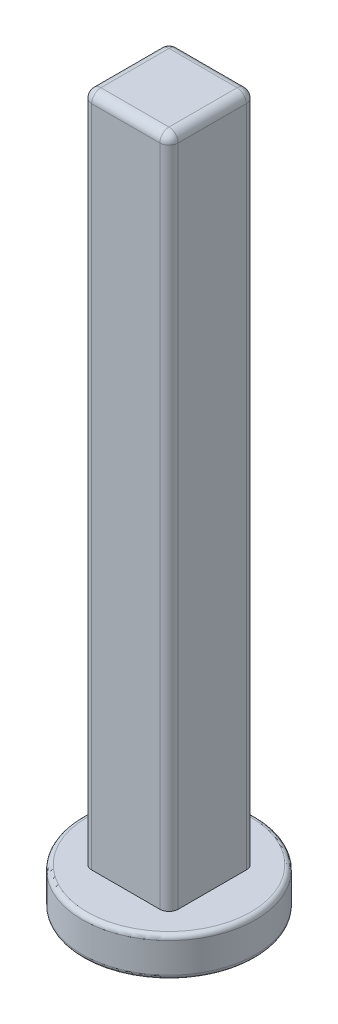
ISO-10303-21;
HEADER;
FILE_DESCRIPTION(('STEP AP214'),'2;1');
FILE_NAME('part.step','',(''),(''),'','','');
FILE_SCHEMA(('AUTOMOTIVE_DESIGN { 1 0 10303 214 1 1 1 1 }'));
ENDSEC;
DATA;
#1=APPLICATION_CONTEXT('core data for automotive mechanical design processes');
#2=APPLICATION_PROTOCOL_DEFINITION('international standard','automotive_design',2000,#1);
#3=PRODUCT_CONTEXT('',#1,'mechanical');
#4=PRODUCT('Part','Part','',(#3));
#5=PRODUCT_RELATED_PRODUCT_CATEGORY('part','',(#4));
#6=PRODUCT_DEFINITION_FORMATION('','',#4);
#7=PRODUCT_DEFINITION_CONTEXT('part definition',#1,'design');
#8=PRODUCT_DEFINITION('design','',#6,#7);
#9=PRODUCT_DEFINITION_SHAPE('','',#8);
#10=(LENGTH_UNIT() NAMED_UNIT(*) SI_UNIT(.MILLI.,.METRE.));
#11=(NAMED_UNIT(*) PLANE_ANGLE_UNIT() SI_UNIT($,.RADIAN.));
#12=(NAMED_UNIT(*) SI_UNIT($,.STERADIAN.) SOLID_ANGLE_UNIT());
#13=UNCERTAINTY_MEASURE_WITH_UNIT(LENGTH_MEASURE(1.E-05),#10,'distance_accuracy_value','');
#14=(GEOMETRIC_REPRESENTATION_CONTEXT(3) GLOBAL_UNCERTAINTY_ASSIGNED_CONTEXT((#13)) GLOBAL_UNIT_ASSIGNED_CONTEXT((#10,
#11,#12)) REPRESENTATION_CONTEXT('',''));
#15=CARTESIAN_POINT('',(0.,0.,0.));
#16=DIRECTION('',(0.,0.,1.));
#17=DIRECTION('',(1.,0.,0.));
#18=AXIS2_PLACEMENT_3D('',#15,#16,#17);
#19=CARTESIAN_POINT('',(0.,-1.7,0.));
#20=DIRECTION('',(0.,-1.,0.));
#21=DIRECTION('',(0.,0.,-1.));
#22=AXIS2_PLACEMENT_3D('',#19,#20,#21);
#23=PLANE('',#22);
#24=CARTESIAN_POINT('',(0.,-1.7,0.));
#25=DIRECTION('',(0.,1.,0.));
#26=DIRECTION('',(0.,0.,1.));
#27=AXIS2_PLACEMENT_3D('',#24,#25,#26);
#28=CIRCLE('',#27,3.55);
#29=CARTESIAN_POINT('',(0.,-1.7,3.55));
#30=VERTEX_POINT('',#29);
#31=CARTESIAN_POINT('',(3.55,-1.7,0.));
#32=VERTEX_POINT('',#31);
#33=EDGE_CURVE('E117',#30,#32,#28,.T.);
#34=ORIENTED_EDGE('',*,*,#33,.F.);
#35=CARTESIAN_POINT('',(0.,-1.7,0.));
#36=DIRECTION('',(0.,1.,0.));
#37=DIRECTION('',(1.,0.,0.));
#38=AXIS2_PLACEMENT_3D('',#35,#36,#37);
#39=CIRCLE('',#38,3.55);
#40=EDGE_CURVE('E114',#32,#30,#39,.T.);
#41=ORIENTED_EDGE('',*,*,#40,.F.);
#42=EDGE_LOOP('',(#34,#41));
#43=FACE_BOUND('',#42,.T.);
#44=ADVANCED_FACE('F16',(#43),#23,.T.);
#45=CARTESIAN_POINT('',(0.,-1.5,0.));
#46=DIRECTION('',(0.,-1.,0.));
#47=DIRECTION('',(0.,0.,-1.));
#48=AXIS2_PLACEMENT_3D('',#45,#46,#47);
#49=TOROIDAL_SURFACE('',#48,3.55,0.2);
#50=CARTESIAN_POINT('',(0.,-1.5,0.));
#51=DIRECTION('',(0.,-1.,0.));
#52=DIRECTION('',(0.,0.,-1.));
#53=AXIS2_PLACEMENT_3D('',#50,#51,#52);
#54=CIRCLE('',#53,3.75);
#55=CARTESIAN_POINT('',(0.,-1.5,-3.75));
#56=VERTEX_POINT('',#55);
#57=EDGE_CURVE('E125',#56,#56,#54,.F.);
#58=ORIENTED_EDGE('',*,*,#57,.F.);
#59=EDGE_LOOP('',(#58));
#60=FACE_BOUND('',#59,.T.);
#61=ORIENTED_EDGE('',*,*,#40,.T.);
#62=ORIENTED_EDGE('',*,*,#33,.T.);
#63=EDGE_LOOP('',(#61,#62));
#64=FACE_BOUND('',#63,.T.);
#65=ADVANCED_FACE('F124',(#60,#64),#49,.T.);
#66=CARTESIAN_POINT('',(-1.475,28.75,1.475));
#67=DIRECTION('',(-0.577350269189624,0.577350269189625,0.577350269189628));
#68=DIRECTION('',(0.,0.70710678118655,-0.707106781186545));
#69=AXIS2_PLACEMENT_3D('',#66,#67,#68);
#70=SPHERICAL_SURFACE('',#69,0.4);
#71=CARTESIAN_POINT('',(-1.70594010767585,28.9809401076759,1.70594010767585));
#72=VERTEX_POINT('',#71);
#73=VERTEX_LOOP('',#72);
#74=FACE_BOUND('',#73,.T.);
#75=CARTESIAN_POINT('',(-1.475,28.75,1.475));
#76=DIRECTION('',(0.,0.,1.));
#77=DIRECTION('',(1.,0.,0.));
#78=AXIS2_PLACEMENT_3D('',#75,#76,#77);
#79=CIRCLE('',#78,0.4);
#80=CARTESIAN_POINT('',(-1.875,28.75,1.475));
#81=VERTEX_POINT('',#80);
#82=CARTESIAN_POINT('',(-1.475,29.15,1.475));
#83=VERTEX_POINT('',#82);
#84=EDGE_CURVE('E336',#81,#83,#79,.F.);
#85=ORIENTED_EDGE('',*,*,#84,.F.);
#86=CARTESIAN_POINT('',(-1.475,28.75,1.475));
#87=DIRECTION('',(0.,1.,0.));
#88=DIRECTION('',(0.,0.,1.));
#89=AXIS2_PLACEMENT_3D('',#86,#87,#88);
#90=CIRCLE('',#89,0.400000000000001);
#91=CARTESIAN_POINT('',(-1.475,28.75,1.875));
#92=VERTEX_POINT('',#91);
#93=EDGE_CURVE('E333',#92,#81,#90,.F.);
#94=ORIENTED_EDGE('',*,*,#93,.F.);
#95=CARTESIAN_POINT('',(-1.475,28.75,1.475));
#96=DIRECTION('',(1.,0.,0.));
#97=DIRECTION('',(0.,0.,-1.));
#98=AXIS2_PLACEMENT_3D('',#95,#96,#97);
#99=CIRCLE('',#98,0.4);
#100=EDGE_CURVE('E99',#83,#92,#99,.T.);
#101=ORIENTED_EDGE('',*,*,#100,.F.);
#102=EDGE_LOOP('',(#85,#94,#101));
#103=FACE_BOUND('',#102,.T.);
#104=ADVANCED_FACE('F141',(#74,#103),#70,.T.);
#105=CARTESIAN_POINT('',(-1.475,28.75,-1.475));
#106=DIRECTION('',(-0.577350269189626,0.577350269189625,-0.577350269189626));
#107=DIRECTION('',(0.707106781186548,0.,-0.707106781186547));
#108=AXIS2_PLACEMENT_3D('',#105,#106,#107);
#109=SPHERICAL_SURFACE('',#108,0.4);
#110=CARTESIAN_POINT('',(-1.70594010767585,28.9809401076759,-1.70594010767585));
#111=VERTEX_POINT('',#110);
#112=VERTEX_LOOP('',#111);
#113=FACE_BOUND('',#112,.T.);
#114=CARTESIAN_POINT('',(-1.475,28.75,-1.475));
#115=DIRECTION('',(-1.,0.,0.));
#116=DIRECTION('',(0.,0.,1.));
#117=AXIS2_PLACEMENT_3D('',#114,#115,#116);
#118=CIRCLE('',#117,0.4);
#119=CARTESIAN_POINT('',(-1.475,28.75,-1.875));
#120=VERTEX_POINT('',#119);
#121=CARTESIAN_POINT('',(-1.475,29.15,-1.475));
#122=VERTEX_POINT('',#121);
#123=EDGE_CURVE('E328',#120,#122,#118,.F.);
#124=ORIENTED_EDGE('',*,*,#123,.F.);
#125=CARTESIAN_POINT('',(-1.475,28.75,-1.475));
#126=DIRECTION('',(0.,1.,0.));
#127=DIRECTION('',(0.,0.,1.));
#128=AXIS2_PLACEMENT_3D('',#125,#126,#127);
#129=CIRCLE('',#128,0.4);
#130=CARTESIAN_POINT('',(-1.875,28.75,-1.475));
#131=VERTEX_POINT('',#130);
#132=EDGE_CURVE('E325',#131,#120,#129,.F.);
#133=ORIENTED_EDGE('',*,*,#132,.F.);
#134=CARTESIAN_POINT('',(-1.475,28.75,-1.475));
#135=DIRECTION('',(0.,0.,1.));
#136=DIRECTION('',(1.,0.,0.));
#137=AXIS2_PLACEMENT_3D('',#134,#135,#136);
#138=CIRCLE('',#137,0.4);
#139=EDGE_CURVE('E339',#122,#131,#138,.T.);
#140=ORIENTED_EDGE('',*,*,#139,.F.);
#141=EDGE_LOOP('',(#124,#133,#140));
#142=FACE_BOUND('',#141,.T.);
#143=ADVANCED_FACE('F153',(#113,#142),#109,.T.);
#144=CARTESIAN_POINT('',(0.,-0.85,0.));
#145=DIRECTION('',(0.,-1.,0.));
#146=DIRECTION('',(0.,0.,-1.));
#147=AXIS2_PLACEMENT_3D('',#144,#145,#146);
#148=CYLINDRICAL_SURFACE('',#147,3.75);
#149=CARTESIAN_POINT('',(0.,-0.2,0.));
#150=DIRECTION('',(0.,-1.,0.));
#151=DIRECTION('',(0.,0.,-1.));
#152=AXIS2_PLACEMENT_3D('',#149,#150,#151);
#153=CIRCLE('',#152,3.75);
#154=CARTESIAN_POINT('',(0.,-0.2,-3.75));
#155=VERTEX_POINT('',#154);
#156=EDGE_CURVE('E225',#155,#155,#153,.F.);
#157=ORIENTED_EDGE('',*,*,#156,.F.);
#158=EDGE_LOOP('',(#157));
#159=FACE_BOUND('',#158,.T.);
#160=ORIENTED_EDGE('',*,*,#57,.T.);
#161=EDGE_LOOP('',(#160));
#162=FACE_BOUND('',#161,.T.);
#163=ADVANCED_FACE('F156',(#159,#162),#148,.T.);
#164=CARTESIAN_POINT('',(-0.7375,28.75,1.475));
#165=DIRECTION('',(1.,0.,0.));
#166=DIRECTION('',(0.,0.,-1.));
#167=AXIS2_PLACEMENT_3D('',#164,#165,#166);
#168=CYLINDRICAL_SURFACE('',#167,0.4);
#169=CARTESIAN_POINT('',(1.475,28.75,1.475));
#170=DIRECTION('',(1.,0.,0.));
#171=DIRECTION('',(0.,0.,-1.));
#172=AXIS2_PLACEMENT_3D('',#169,#170,#171);
#173=CIRCLE('',#172,0.4);
#174=CARTESIAN_POINT('',(1.475,29.15,1.475));
#175=VERTEX_POINT('',#174);
#176=CARTESIAN_POINT('',(1.475,28.75,1.875));
#177=VERTEX_POINT('',#176);
#178=EDGE_CURVE('E205',#175,#177,#173,.T.);
#179=ORIENTED_EDGE('',*,*,#178,.F.);
#180=DIRECTION('',(1.,0.,0.));
#181=VECTOR('',#180,1.);
#182=CARTESIAN_POINT('',(0.,29.15,1.475));
#183=LINE('',#182,#181);
#184=EDGE_CURVE('E206',#175,#83,#183,.F.);
#185=ORIENTED_EDGE('',*,*,#184,.T.);
#186=ORIENTED_EDGE('',*,*,#100,.T.);
#187=DIRECTION('',(1.,0.,0.));
#188=VECTOR('',#187,1.);
#189=CARTESIAN_POINT('',(-1.475,28.75,1.875));
#190=LINE('',#189,#188);
#191=EDGE_CURVE('E196',#177,#92,#190,.F.);
#192=ORIENTED_EDGE('',*,*,#191,.F.);
#193=EDGE_LOOP('',(#179,#185,#186,#192));
#194=FACE_BOUND('',#193,.T.);
#195=ADVANCED_FACE('F159',(#194),#168,.T.);
#196=CARTESIAN_POINT('',(-1.475,28.75,-0.7375));
#197=DIRECTION('',(0.,0.,1.));
#198=DIRECTION('',(1.,0.,0.));
#199=AXIS2_PLACEMENT_3D('',#196,#197,#198);
#200=CYLINDRICAL_SURFACE('',#199,0.4);
#201=ORIENTED_EDGE('',*,*,#84,.T.);
#202=DIRECTION('',(0.,0.,-1.));
#203=VECTOR('',#202,1.);
#204=CARTESIAN_POINT('',(-1.475,29.15,0.));
#205=LINE('',#204,#203);
#206=EDGE_CURVE('E151',#83,#122,#205,.T.);
#207=ORIENTED_EDGE('',*,*,#206,.T.);
#208=ORIENTED_EDGE('',*,*,#139,.T.);
#209=DIRECTION('',(0.,0.,1.));
#210=VECTOR('',#209,1.);
#211=CARTESIAN_POINT('',(-1.875,28.75,-1.475));
#212=LINE('',#211,#210);
#213=EDGE_CURVE('E208',#81,#131,#212,.F.);
#214=ORIENTED_EDGE('',*,*,#213,.F.);
#215=EDGE_LOOP('',(#201,#207,#208,#214));
#216=FACE_BOUND('',#215,.T.);
#217=ADVANCED_FACE('F163',(#216),#200,.T.);
#218=CARTESIAN_POINT('',(-1.475,0.,1.475));
#219=DIRECTION('',(0.,1.,0.));
#220=DIRECTION('',(0.,0.,1.));
#221=AXIS2_PLACEMENT_3D('',#218,#219,#220);
#222=CYLINDRICAL_SURFACE('',#221,0.400000000000001);
#223=CARTESIAN_POINT('',(-1.475,0.,1.475));
#224=DIRECTION('',(0.,1.,0.));
#225=DIRECTION('',(0.,0.,1.));
#226=AXIS2_PLACEMENT_3D('',#223,#224,#225);
#227=CIRCLE('',#226,0.400000000000001);
#228=CARTESIAN_POINT('',(-1.875,0.,1.475));
#229=VERTEX_POINT('',#228);
#230=CARTESIAN_POINT('',(-1.475,0.,1.875));
#231=VERTEX_POINT('',#230);
#232=EDGE_CURVE('E331',#229,#231,#227,.T.);
#233=ORIENTED_EDGE('',*,*,#232,.T.);
#234=DIRECTION('',(0.,1.,0.));
#235=VECTOR('',#234,1.);
#236=CARTESIAN_POINT('',(-1.475,0.,1.875));
#237=LINE('',#236,#235);
#238=EDGE_CURVE('E211',#92,#231,#237,.F.);
#239=ORIENTED_EDGE('',*,*,#238,.F.);
#240=ORIENTED_EDGE('',*,*,#93,.T.);
#241=DIRECTION('',(0.,1.,0.));
#242=VECTOR('',#241,1.);
#243=CARTESIAN_POINT('',(-1.875,0.,1.475));
#244=LINE('',#243,#242);
#245=EDGE_CURVE('E216',#229,#81,#244,.T.);
#246=ORIENTED_EDGE('',*,*,#245,.F.);
#247=EDGE_LOOP('',(#233,#239,#240,#246));
#248=FACE_BOUND('',#247,.T.);
#249=ADVANCED_FACE('F167',(#248),#222,.T.);
#250=CARTESIAN_POINT('',(0.7375,28.75,-1.475));
#251=DIRECTION('',(-1.,0.,0.));
#252=DIRECTION('',(0.,0.,1.));
#253=AXIS2_PLACEMENT_3D('',#250,#251,#252);
#254=CYLINDRICAL_SURFACE('',#253,0.4);
#255=ORIENTED_EDGE('',*,*,#123,.T.);
#256=DIRECTION('',(1.,0.,0.));
#257=VECTOR('',#256,1.);
#258=CARTESIAN_POINT('',(0.,29.15,-1.475));
#259=LINE('',#258,#257);
#260=CARTESIAN_POINT('',(1.475,29.15,-1.475));
#261=VERTEX_POINT('',#260);
#262=EDGE_CURVE('E203',#122,#261,#259,.T.);
#263=ORIENTED_EDGE('',*,*,#262,.T.);
#264=CARTESIAN_POINT('',(1.475,28.75,-1.475));
#265=DIRECTION('',(-1.,0.,0.));
#266=DIRECTION('',(0.,0.,1.));
#267=AXIS2_PLACEMENT_3D('',#264,#265,#266);
#268=CIRCLE('',#267,0.4);
#269=CARTESIAN_POINT('',(1.475,28.75,-1.875));
#270=VERTEX_POINT('',#269);
#271=EDGE_CURVE('E309',#270,#261,#268,.F.);
#272=ORIENTED_EDGE('',*,*,#271,.F.);
#273=DIRECTION('',(-1.,0.,0.));
#274=VECTOR('',#273,1.);
#275=CARTESIAN_POINT('',(1.475,28.75,-1.875));
#276=LINE('',#275,#274);
#277=EDGE_CURVE('E305',#120,#270,#276,.F.);
#278=ORIENTED_EDGE('',*,*,#277,.F.);
#279=EDGE_LOOP('',(#255,#263,#272,#278));
#280=FACE_BOUND('',#279,.T.);
#281=ADVANCED_FACE('F171',(#280),#254,.T.);
#282=CARTESIAN_POINT('',(-1.475,0.,-1.475));
#283=DIRECTION('',(0.,1.,0.));
#284=DIRECTION('',(0.,0.,1.));
#285=AXIS2_PLACEMENT_3D('',#282,#283,#284);
#286=CYLINDRICAL_SURFACE('',#285,0.4);
#287=CARTESIAN_POINT('',(-1.475,0.,-1.475));
#288=DIRECTION('',(0.,1.,0.));
#289=DIRECTION('',(0.,0.,1.));
#290=AXIS2_PLACEMENT_3D('',#287,#288,#289);
#291=CIRCLE('',#290,0.4);
#292=CARTESIAN_POINT('',(-1.475,0.,-1.875));
#293=VERTEX_POINT('',#292);
#294=CARTESIAN_POINT('',(-1.875,0.,-1.475));
#295=VERTEX_POINT('',#294);
#296=EDGE_CURVE('E207',#293,#295,#291,.T.);
#297=ORIENTED_EDGE('',*,*,#296,.T.);
#298=DIRECTION('',(0.,1.,0.));
#299=VECTOR('',#298,1.);
#300=CARTESIAN_POINT('',(-1.875,0.,-1.475));
#301=LINE('',#300,#299);
#302=EDGE_CURVE('E210',#131,#295,#301,.F.);
#303=ORIENTED_EDGE('',*,*,#302,.F.);
#304=ORIENTED_EDGE('',*,*,#132,.T.);
#305=DIRECTION('',(0.,1.,0.));
#306=VECTOR('',#305,1.);
#307=CARTESIAN_POINT('',(-1.475,0.,-1.875));
#308=LINE('',#307,#306);
#309=EDGE_CURVE('E308',#293,#120,#308,.T.);
#310=ORIENTED_EDGE('',*,*,#309,.F.);
#311=EDGE_LOOP('',(#297,#303,#304,#310));
#312=FACE_BOUND('',#311,.T.);
#313=ADVANCED_FACE('F175',(#312),#286,.T.);
#314=CARTESIAN_POINT('',(0.,29.15,0.));
#315=DIRECTION('',(0.,-1.,0.));
#316=DIRECTION('',(0.,0.,-1.));
#317=AXIS2_PLACEMENT_3D('',#314,#315,#316);
#318=PLANE('',#317);
#319=ORIENTED_EDGE('',*,*,#262,.F.);
#320=ORIENTED_EDGE('',*,*,#206,.F.);
#321=ORIENTED_EDGE('',*,*,#184,.F.);
#322=DIRECTION('',(0.,0.,-1.));
#323=VECTOR('',#322,1.);
#324=CARTESIAN_POINT('',(1.475,29.15,0.7375));
#325=LINE('',#324,#323);
#326=EDGE_CURVE('E198',#261,#175,#325,.F.);
#327=ORIENTED_EDGE('',*,*,#326,.F.);
#328=EDGE_LOOP('',(#319,#320,#321,#327));
#329=FACE_BOUND('',#328,.T.);
#330=ADVANCED_FACE('F179',(#329),#318,.F.);
#331=CARTESIAN_POINT('',(1.475,28.75,1.475));
#332=DIRECTION('',(0.577350269189624,0.577350269189625,0.577350269189628));
#333=DIRECTION('',(0.,0.70710678118655,-0.707106781186545));
#334=AXIS2_PLACEMENT_3D('',#331,#332,#333);
#335=SPHERICAL_SURFACE('',#334,0.4);
#336=CARTESIAN_POINT('',(1.70594010767585,28.9809401076759,1.70594010767585));
#337=VERTEX_POINT('',#336);
#338=VERTEX_LOOP('',#337);
#339=FACE_BOUND('',#338,.T.);
#340=ORIENTED_EDGE('',*,*,#178,.T.);
#341=CARTESIAN_POINT('',(1.475,28.75,1.475));
#342=DIRECTION('',(0.,1.,0.));
#343=DIRECTION('',(0.,0.,1.));
#344=AXIS2_PLACEMENT_3D('',#341,#342,#343);
#345=CIRCLE('',#344,0.4);
#346=CARTESIAN_POINT('',(1.875,28.75,1.475));
#347=VERTEX_POINT('',#346);
#348=EDGE_CURVE('E201',#347,#177,#345,.F.);
#349=ORIENTED_EDGE('',*,*,#348,.F.);
#350=CARTESIAN_POINT('',(1.475,28.75,1.475));
#351=DIRECTION('',(0.,0.,-1.));
#352=DIRECTION('',(-1.,0.,0.));
#353=AXIS2_PLACEMENT_3D('',#350,#351,#352);
#354=CIRCLE('',#353,0.4);
#355=EDGE_CURVE('E311',#175,#347,#354,.T.);
#356=ORIENTED_EDGE('',*,*,#355,.F.);
#357=EDGE_LOOP('',(#340,#349,#356));
#358=FACE_BOUND('',#357,.T.);
#359=ADVANCED_FACE('F183',(#339,#358),#335,.T.);
#360=CARTESIAN_POINT('',(0.,-0.2,0.));
#361=DIRECTION('',(0.,-1.,0.));
#362=DIRECTION('',(0.,0.,-1.));
#363=AXIS2_PLACEMENT_3D('',#360,#361,#362);
#364=TOROIDAL_SURFACE('',#363,3.55,0.2);
#365=CARTESIAN_POINT('',(0.,0.,0.));
#366=DIRECTION('',(0.,-1.,0.));
#367=DIRECTION('',(1.,0.,0.));
#368=AXIS2_PLACEMENT_3D('',#365,#366,#367);
#369=CIRCLE('',#368,3.55);
#370=CARTESIAN_POINT('',(0.,0.,3.55));
#371=VERTEX_POINT('',#370);
#372=CARTESIAN_POINT('',(3.55,0.,0.));
#373=VERTEX_POINT('',#372);
#374=EDGE_CURVE('E229',#371,#373,#369,.F.);
#375=ORIENTED_EDGE('',*,*,#374,.F.);
#376=CARTESIAN_POINT('',(0.,0.,0.));
#377=DIRECTION('',(0.,-1.,0.));
#378=DIRECTION('',(0.,0.,1.));
#379=AXIS2_PLACEMENT_3D('',#376,#377,#378);
#380=CIRCLE('',#379,3.55);
#381=EDGE_CURVE('E237',#373,#371,#380,.F.);
#382=ORIENTED_EDGE('',*,*,#381,.F.);
#383=EDGE_LOOP('',(#375,#382));
#384=FACE_BOUND('',#383,.T.);
#385=ORIENTED_EDGE('',*,*,#156,.T.);
#386=EDGE_LOOP('',(#385));
#387=FACE_BOUND('',#386,.T.);
#388=ADVANCED_FACE('F188',(#384,#387),#364,.T.);
#389=CARTESIAN_POINT('',(-1.475,0.,1.875));
#390=DIRECTION('',(0.,0.,1.));
#391=DIRECTION('',(1.,0.,0.));
#392=AXIS2_PLACEMENT_3D('',#389,#390,#391);
#393=PLANE('',#392);
#394=DIRECTION('',(1.,0.,0.));
#395=VECTOR('',#394,1.);
#396=CARTESIAN_POINT('',(3.55,0.,1.875));
#397=LINE('',#396,#395);
#398=CARTESIAN_POINT('',(1.475,0.,1.875));
#399=VERTEX_POINT('',#398);
#400=EDGE_CURVE('E384',#399,#231,#397,.F.);
#401=ORIENTED_EDGE('',*,*,#400,.F.);
#402=DIRECTION('',(0.,1.,0.));
#403=VECTOR('',#402,1.);
#404=CARTESIAN_POINT('',(1.475,0.,1.875));
#405=LINE('',#404,#403);
#406=EDGE_CURVE('E228',#177,#399,#405,.F.);
#407=ORIENTED_EDGE('',*,*,#406,.F.);
#408=ORIENTED_EDGE('',*,*,#191,.T.);
#409=ORIENTED_EDGE('',*,*,#238,.T.);
#410=EDGE_LOOP('',(#401,#407,#408,#409));
#411=FACE_BOUND('',#410,.T.);
#412=ADVANCED_FACE('F351',(#411),#393,.T.);
#413=CARTESIAN_POINT('',(-1.875,0.,-1.475));
#414=DIRECTION('',(-1.,0.,0.));
#415=DIRECTION('',(0.,0.,1.));
#416=AXIS2_PLACEMENT_3D('',#413,#414,#415);
#417=PLANE('',#416);
#418=DIRECTION('',(0.,0.,1.));
#419=VECTOR('',#418,1.);
#420=CARTESIAN_POINT('',(-1.875,0.,0.));
#421=LINE('',#420,#419);
#422=EDGE_CURVE('E393',#229,#295,#421,.F.);
#423=ORIENTED_EDGE('',*,*,#422,.F.);
#424=ORIENTED_EDGE('',*,*,#245,.T.);
#425=ORIENTED_EDGE('',*,*,#213,.T.);
#426=ORIENTED_EDGE('',*,*,#302,.T.);
#427=EDGE_LOOP('',(#423,#424,#425,#426));
#428=FACE_BOUND('',#427,.T.);
#429=ADVANCED_FACE('F298',(#428),#417,.T.);
#430=CARTESIAN_POINT('',(1.475,28.75,-1.475));
#431=DIRECTION('',(0.577350269189624,0.577350269189625,-0.577350269189628));
#432=DIRECTION('',(0.,-0.70710678118655,-0.707106781186545));
#433=AXIS2_PLACEMENT_3D('',#430,#431,#432);
#434=SPHERICAL_SURFACE('',#433,0.4);
#435=CARTESIAN_POINT('',(1.70594010767585,28.9809401076759,-1.70594010767585));
#436=VERTEX_POINT('',#435);
#437=VERTEX_LOOP('',#436);
#438=FACE_BOUND('',#437,.T.);
#439=CARTESIAN_POINT('',(1.475,28.75,-1.475));
#440=DIRECTION('',(0.,0.,-1.));
#441=DIRECTION('',(-1.,0.,0.));
#442=AXIS2_PLACEMENT_3D('',#439,#440,#441);
#443=CIRCLE('',#442,0.4);
#444=CARTESIAN_POINT('',(1.875,28.75,-1.475));
#445=VERTEX_POINT('',#444);
#446=EDGE_CURVE('E202',#445,#261,#443,.F.);
#447=ORIENTED_EDGE('',*,*,#446,.F.);
#448=CARTESIAN_POINT('',(1.475,28.75,-1.475));
#449=DIRECTION('',(0.,1.,0.));
#450=DIRECTION('',(0.,0.,1.));
#451=AXIS2_PLACEMENT_3D('',#448,#449,#450);
#452=CIRCLE('',#451,0.4);
#453=EDGE_CURVE('E377',#270,#445,#452,.F.);
#454=ORIENTED_EDGE('',*,*,#453,.F.);
#455=ORIENTED_EDGE('',*,*,#271,.T.);
#456=EDGE_LOOP('',(#447,#454,#455));
#457=FACE_BOUND('',#456,.T.);
#458=ADVANCED_FACE('F293',(#438,#457),#434,.T.);
#459=CARTESIAN_POINT('',(1.475,0.,-1.875));
#460=DIRECTION('',(0.,0.,-1.));
#461=DIRECTION('',(-1.,0.,0.));
#462=AXIS2_PLACEMENT_3D('',#459,#460,#461);
#463=PLANE('',#462);
#464=DIRECTION('',(1.,0.,0.));
#465=VECTOR('',#464,1.);
#466=CARTESIAN_POINT('',(3.55,0.,-1.875));
#467=LINE('',#466,#465);
#468=CARTESIAN_POINT('',(1.475,0.,-1.875));
#469=VERTEX_POINT('',#468);
#470=EDGE_CURVE('E268',#293,#469,#467,.T.);
#471=ORIENTED_EDGE('',*,*,#470,.F.);
#472=ORIENTED_EDGE('',*,*,#309,.T.);
#473=ORIENTED_EDGE('',*,*,#277,.T.);
#474=DIRECTION('',(0.,1.,0.));
#475=VECTOR('',#474,1.);
#476=CARTESIAN_POINT('',(1.475,0.,-1.875));
#477=LINE('',#476,#475);
#478=EDGE_CURVE('E303',#469,#270,#477,.T.);
#479=ORIENTED_EDGE('',*,*,#478,.F.);
#480=EDGE_LOOP('',(#471,#472,#473,#479));
#481=FACE_BOUND('',#480,.T.);
#482=ADVANCED_FACE('F289',(#481),#463,.T.);
#483=CARTESIAN_POINT('',(1.475,28.75,0.7375));
#484=DIRECTION('',(0.,0.,-1.));
#485=DIRECTION('',(-1.,0.,0.));
#486=AXIS2_PLACEMENT_3D('',#483,#484,#485);
#487=CYLINDRICAL_SURFACE('',#486,0.4);
#488=ORIENTED_EDGE('',*,*,#446,.T.);
#489=ORIENTED_EDGE('',*,*,#326,.T.);
#490=ORIENTED_EDGE('',*,*,#355,.T.);
#491=DIRECTION('',(0.,0.,-1.));
#492=VECTOR('',#491,1.);
#493=CARTESIAN_POINT('',(1.875,28.75,1.475));
#494=LINE('',#493,#492);
#495=EDGE_CURVE('E370',#445,#347,#494,.F.);
#496=ORIENTED_EDGE('',*,*,#495,.F.);
#497=EDGE_LOOP('',(#488,#489,#490,#496));
#498=FACE_BOUND('',#497,.T.);
#499=ADVANCED_FACE('F285',(#498),#487,.T.);
#500=CARTESIAN_POINT('',(1.475,0.,1.475));
#501=DIRECTION('',(0.,1.,0.));
#502=DIRECTION('',(0.,0.,1.));
#503=AXIS2_PLACEMENT_3D('',#500,#501,#502);
#504=CYLINDRICAL_SURFACE('',#503,0.4);
#505=CARTESIAN_POINT('',(1.475,0.,1.475));
#506=DIRECTION('',(0.,1.,0.));
#507=DIRECTION('',(0.,0.,1.));
#508=AXIS2_PLACEMENT_3D('',#505,#506,#507);
#509=CIRCLE('',#508,0.4);
#510=CARTESIAN_POINT('',(1.875,0.,1.475));
#511=VERTEX_POINT('',#510);
#512=EDGE_CURVE('E259',#511,#399,#509,.F.);
#513=ORIENTED_EDGE('',*,*,#512,.F.);
#514=DIRECTION('',(0.,1.,0.));
#515=VECTOR('',#514,1.);
#516=CARTESIAN_POINT('',(1.875,0.,1.475));
#517=LINE('',#516,#515);
#518=EDGE_CURVE('E367',#347,#511,#517,.F.);
#519=ORIENTED_EDGE('',*,*,#518,.F.);
#520=ORIENTED_EDGE('',*,*,#348,.T.);
#521=ORIENTED_EDGE('',*,*,#406,.T.);
#522=EDGE_LOOP('',(#513,#519,#520,#521));
#523=FACE_BOUND('',#522,.T.);
#524=ADVANCED_FACE('F280',(#523),#504,.T.);
#525=CARTESIAN_POINT('',(3.55,0.,0.));
#526=DIRECTION('',(0.,1.,0.));
#527=DIRECTION('',(0.,0.,1.));
#528=AXIS2_PLACEMENT_3D('',#525,#526,#527);
#529=PLANE('',#528);
#530=ORIENTED_EDGE('',*,*,#296,.F.);
#531=ORIENTED_EDGE('',*,*,#470,.T.);
#532=CARTESIAN_POINT('',(1.475,0.,-1.475));
#533=DIRECTION('',(0.,1.,0.));
#534=DIRECTION('',(0.,0.,1.));
#535=AXIS2_PLACEMENT_3D('',#532,#533,#534);
#536=CIRCLE('',#535,0.4);
#537=CARTESIAN_POINT('',(1.875,0.,-1.475));
#538=VERTEX_POINT('',#537);
#539=EDGE_CURVE('E35',#538,#469,#536,.T.);
#540=ORIENTED_EDGE('',*,*,#539,.F.);
#541=DIRECTION('',(0.,0.,-1.));
#542=VECTOR('',#541,1.);
#543=CARTESIAN_POINT('',(1.875,0.,1.475));
#544=LINE('',#543,#542);
#545=EDGE_CURVE('E26',#511,#538,#544,.T.);
#546=ORIENTED_EDGE('',*,*,#545,.F.);
#547=ORIENTED_EDGE('',*,*,#512,.T.);
#548=ORIENTED_EDGE('',*,*,#400,.T.);
#549=ORIENTED_EDGE('',*,*,#232,.F.);
#550=ORIENTED_EDGE('',*,*,#422,.T.);
#551=EDGE_LOOP('',(#530,#531,#540,#546,#547,#548,#549,#550));
#552=FACE_BOUND('',#551,.T.);
#553=ORIENTED_EDGE('',*,*,#374,.T.);
#554=ORIENTED_EDGE('',*,*,#381,.T.);
#555=EDGE_LOOP('',(#553,#554));
#556=FACE_BOUND('',#555,.T.);
#557=ADVANCED_FACE('F258',(#552,#556),#529,.T.);
#558=CARTESIAN_POINT('',(1.475,0.,-1.475));
#559=DIRECTION('',(0.,1.,0.));
#560=DIRECTION('',(0.,0.,1.));
#561=AXIS2_PLACEMENT_3D('',#558,#559,#560);
#562=CYLINDRICAL_SURFACE('',#561,0.4);
#563=ORIENTED_EDGE('',*,*,#539,.T.);
#564=ORIENTED_EDGE('',*,*,#478,.T.);
#565=ORIENTED_EDGE('',*,*,#453,.T.);
#566=DIRECTION('',(0.,1.,0.));
#567=VECTOR('',#566,1.);
#568=CARTESIAN_POINT('',(1.875,0.,-1.475));
#569=LINE('',#568,#567);
#570=EDGE_CURVE('E10',#538,#445,#569,.T.);
#571=ORIENTED_EDGE('',*,*,#570,.F.);
#572=EDGE_LOOP('',(#563,#564,#565,#571));
#573=FACE_BOUND('',#572,.T.);
#574=ADVANCED_FACE('F279',(#573),#562,.T.);
#575=CARTESIAN_POINT('',(1.875,0.,1.475));
#576=DIRECTION('',(1.,0.,0.));
#577=DIRECTION('',(0.,0.,-1.));
#578=AXIS2_PLACEMENT_3D('',#575,#576,#577);
#579=PLANE('',#578);
#580=ORIENTED_EDGE('',*,*,#545,.T.);
#581=ORIENTED_EDGE('',*,*,#570,.T.);
#582=ORIENTED_EDGE('',*,*,#495,.T.);
#583=ORIENTED_EDGE('',*,*,#518,.T.);
#584=EDGE_LOOP('',(#580,#581,#582,#583));
#585=FACE_BOUND('',#584,.T.);
#586=ADVANCED_FACE('F356',(#585),#579,.T.);
#587=CLOSED_SHELL('',(#44,#65,#104,#143,#163,#195,#217,#249,#281,#313,#330,#359,#388,#412,#429,
#458,#482,#499,#524,#557,#574,#586));
#588=MANIFOLD_SOLID_BREP('B1',#587);
#589=ADVANCED_BREP_SHAPE_REPRESENTATION('',(#18,#588),#14);
#590=SHAPE_DEFINITION_REPRESENTATION(#9,#589);
ENDSEC;
END-ISO-10303-21;
